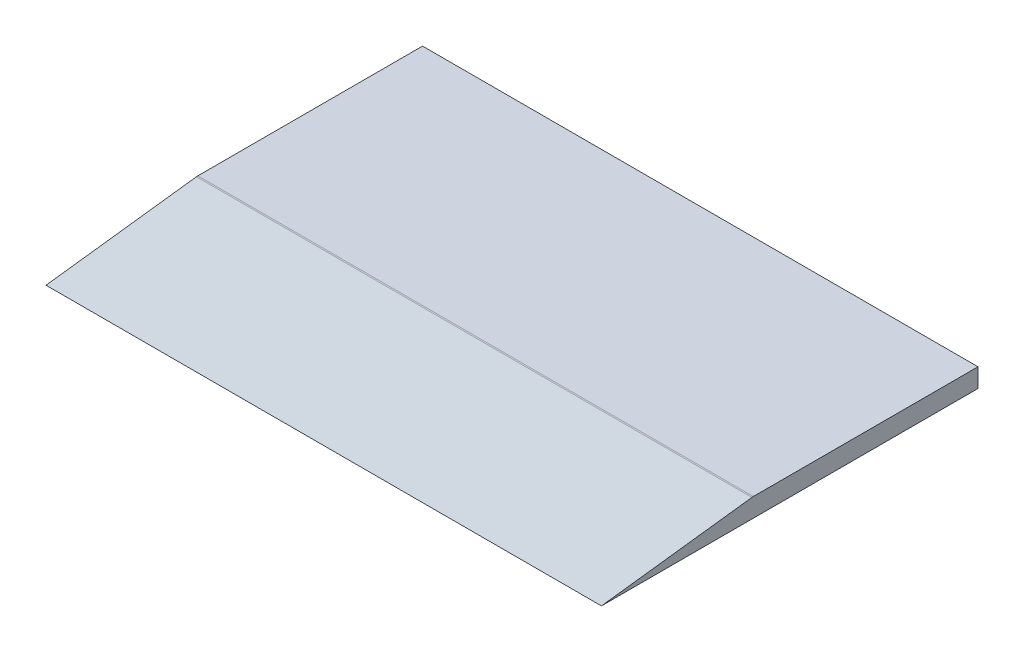
ISO-10303-21;
HEADER;
FILE_DESCRIPTION(('STEP AP214'),'2;1');
FILE_NAME('part.step','',(''),(''),'','','');
FILE_SCHEMA(('AUTOMOTIVE_DESIGN { 1 0 10303 214 1 1 1 1 }'));
ENDSEC;
DATA;
#1=APPLICATION_CONTEXT('core data for automotive mechanical design processes');
#2=APPLICATION_PROTOCOL_DEFINITION('international standard','automotive_design',2000,#1);
#3=PRODUCT_CONTEXT('',#1,'mechanical');
#4=PRODUCT('Part','Part','',(#3));
#5=PRODUCT_RELATED_PRODUCT_CATEGORY('part','',(#4));
#6=PRODUCT_DEFINITION_FORMATION('','',#4);
#7=PRODUCT_DEFINITION_CONTEXT('part definition',#1,'design');
#8=PRODUCT_DEFINITION('design','',#6,#7);
#9=PRODUCT_DEFINITION_SHAPE('','',#8);
#10=(LENGTH_UNIT() NAMED_UNIT(*) SI_UNIT(.MILLI.,.METRE.));
#11=(NAMED_UNIT(*) PLANE_ANGLE_UNIT() SI_UNIT($,.RADIAN.));
#12=(NAMED_UNIT(*) SI_UNIT($,.STERADIAN.) SOLID_ANGLE_UNIT());
#13=UNCERTAINTY_MEASURE_WITH_UNIT(LENGTH_MEASURE(1.E-05),#10,'distance_accuracy_value','');
#14=(GEOMETRIC_REPRESENTATION_CONTEXT(3) GLOBAL_UNCERTAINTY_ASSIGNED_CONTEXT((#13)) GLOBAL_UNIT_ASSIGNED_CONTEXT((#10,
#11,#12)) REPRESENTATION_CONTEXT('',''));
#15=CARTESIAN_POINT('',(0.,0.,0.));
#16=DIRECTION('',(0.,0.,1.));
#17=DIRECTION('',(1.,0.,0.));
#18=AXIS2_PLACEMENT_3D('',#15,#16,#17);
#19=CARTESIAN_POINT('',(0.,12.7,0.));
#20=DIRECTION('',(1.,0.,0.));
#21=DIRECTION('',(0.,0.,-1.));
#22=AXIS2_PLACEMENT_3D('',#19,#20,#21);
#23=PLANE('',#22);
#24=DIRECTION('',(0.,-0.1236014767405,0.992331937885488));
#25=VECTOR('',#24,1.);
#26=CARTESIAN_POINT('',(0.,12.7,-101.961691263647));
#27=LINE('',#26,#25);
#28=CARTESIAN_POINT('',(0.,12.6415693666874,-101.492582114501));
#29=VERTEX_POINT('',#28);
#30=CARTESIAN_POINT('',(0.,0.,0.));
#31=VERTEX_POINT('',#30);
#32=EDGE_CURVE('E96',#29,#31,#27,.T.);
#33=ORIENTED_EDGE('',*,*,#32,.F.);
#34=CARTESIAN_POINT('',(0.,5.08,-102.434425367263));
#35=DIRECTION('',(1.,0.,0.));
#36=DIRECTION('',(0.,0.,-1.));
#37=AXIS2_PLACEMENT_3D('',#34,#35,#36);
#38=CIRCLE('',#37,7.62);
#39=CARTESIAN_POINT('',(0.,12.7,-102.434425367263));
#40=VERTEX_POINT('',#39);
#41=EDGE_CURVE('E11',#29,#40,#38,.F.);
#42=ORIENTED_EDGE('',*,*,#41,.T.);
#43=DIRECTION('',(0.,0.,1.));
#44=VECTOR('',#43,1.);
#45=CARTESIAN_POINT('',(0.,12.7,0.));
#46=LINE('',#45,#44);
#47=CARTESIAN_POINT('',(0.,12.7,-254.));
#48=VERTEX_POINT('',#47);
#49=EDGE_CURVE('E113',#48,#40,#46,.T.);
#50=ORIENTED_EDGE('',*,*,#49,.F.);
#51=DIRECTION('',(0.,-1.,0.));
#52=VECTOR('',#51,1.);
#53=CARTESIAN_POINT('',(0.,12.7,-254.));
#54=LINE('',#53,#52);
#55=CARTESIAN_POINT('',(0.,0.,-254.));
#56=VERTEX_POINT('',#55);
#57=EDGE_CURVE('E117',#48,#56,#54,.T.);
#58=ORIENTED_EDGE('',*,*,#57,.T.);
#59=DIRECTION('',(0.,0.,1.));
#60=VECTOR('',#59,1.);
#61=CARTESIAN_POINT('',(0.,0.,0.));
#62=LINE('',#61,#60);
#63=EDGE_CURVE('E105',#56,#31,#62,.T.);
#64=ORIENTED_EDGE('',*,*,#63,.T.);
#65=EDGE_LOOP('',(#33,#42,#50,#58,#64));
#66=FACE_BOUND('',#65,.T.);
#67=ADVANCED_FACE('F45',(#66),#23,.F.);
#68=CARTESIAN_POINT('',(374.6754,12.7,0.));
#69=DIRECTION('',(-1.,0.,0.));
#70=DIRECTION('',(0.,0.,1.));
#71=AXIS2_PLACEMENT_3D('',#68,#69,#70);
#72=PLANE('',#71);
#73=DIRECTION('',(0.,0.,-1.));
#74=VECTOR('',#73,1.);
#75=CARTESIAN_POINT('',(374.6754,12.7,0.));
#76=LINE('',#75,#74);
#77=CARTESIAN_POINT('',(374.6754,12.7,-102.434425367263));
#78=VERTEX_POINT('',#77);
#79=CARTESIAN_POINT('',(374.6754,12.7,-254.));
#80=VERTEX_POINT('',#79);
#81=EDGE_CURVE('E133',#78,#80,#76,.T.);
#82=ORIENTED_EDGE('',*,*,#81,.F.);
#83=CARTESIAN_POINT('',(374.6754,5.08,-102.434425367263));
#84=DIRECTION('',(-1.,0.,0.));
#85=DIRECTION('',(0.,0.,1.));
#86=AXIS2_PLACEMENT_3D('',#83,#84,#85);
#87=CIRCLE('',#86,7.62);
#88=CARTESIAN_POINT('',(374.6754,12.6415693666874,-101.492582114501));
#89=VERTEX_POINT('',#88);
#90=EDGE_CURVE('E68',#78,#89,#87,.F.);
#91=ORIENTED_EDGE('',*,*,#90,.T.);
#92=DIRECTION('',(0.,-0.1236014767405,0.992331937885488));
#93=VECTOR('',#92,1.);
#94=CARTESIAN_POINT('',(374.6754,12.7,-101.961691263647));
#95=LINE('',#94,#93);
#96=CARTESIAN_POINT('',(374.6754,0.,0.));
#97=VERTEX_POINT('',#96);
#98=EDGE_CURVE('E88',#89,#97,#95,.T.);
#99=ORIENTED_EDGE('',*,*,#98,.T.);
#100=DIRECTION('',(0.,0.,-1.));
#101=VECTOR('',#100,1.);
#102=CARTESIAN_POINT('',(374.6754,0.,0.));
#103=LINE('',#102,#101);
#104=CARTESIAN_POINT('',(374.6754,0.,-254.));
#105=VERTEX_POINT('',#104);
#106=EDGE_CURVE('E93',#97,#105,#103,.T.);
#107=ORIENTED_EDGE('',*,*,#106,.T.);
#108=DIRECTION('',(0.,-1.,0.));
#109=VECTOR('',#108,1.);
#110=CARTESIAN_POINT('',(374.6754,12.7,-254.));
#111=LINE('',#110,#109);
#112=EDGE_CURVE('E121',#80,#105,#111,.T.);
#113=ORIENTED_EDGE('',*,*,#112,.F.);
#114=EDGE_LOOP('',(#82,#91,#99,#107,#113));
#115=FACE_BOUND('',#114,.T.);
#116=ADVANCED_FACE('F90',(#115),#72,.F.);
#117=CARTESIAN_POINT('',(0.,12.7,0.));
#118=DIRECTION('',(0.,-1.,0.));
#119=DIRECTION('',(0.,0.,-1.));
#120=AXIS2_PLACEMENT_3D('',#117,#118,#119);
#121=PLANE('',#120);
#122=ORIENTED_EDGE('',*,*,#49,.T.);
#123=DIRECTION('',(1.,0.,0.));
#124=VECTOR('',#123,1.);
#125=CARTESIAN_POINT('',(374.6754,12.7,-102.434425367263));
#126=LINE('',#125,#124);
#127=EDGE_CURVE('E125',#40,#78,#126,.T.);
#128=ORIENTED_EDGE('',*,*,#127,.T.);
#129=ORIENTED_EDGE('',*,*,#81,.T.);
#130=DIRECTION('',(-1.,0.,0.));
#131=VECTOR('',#130,1.);
#132=CARTESIAN_POINT('',(0.,12.7,-254.));
#133=LINE('',#132,#131);
#134=EDGE_CURVE('E122',#80,#48,#133,.T.);
#135=ORIENTED_EDGE('',*,*,#134,.T.);
#136=EDGE_LOOP('',(#122,#128,#129,#135));
#137=FACE_BOUND('',#136,.T.);
#138=ADVANCED_FACE('F151',(#137),#121,.F.);
#139=CARTESIAN_POINT('',(0.,12.7,-254.));
#140=DIRECTION('',(0.,0.,1.));
#141=DIRECTION('',(1.,0.,0.));
#142=AXIS2_PLACEMENT_3D('',#139,#140,#141);
#143=PLANE('',#142);
#144=DIRECTION('',(-1.,0.,0.));
#145=VECTOR('',#144,1.);
#146=CARTESIAN_POINT('',(0.,0.,-254.));
#147=LINE('',#146,#145);
#148=EDGE_CURVE('E109',#105,#56,#147,.T.);
#149=ORIENTED_EDGE('',*,*,#148,.T.);
#150=ORIENTED_EDGE('',*,*,#57,.F.);
#151=ORIENTED_EDGE('',*,*,#134,.F.);
#152=ORIENTED_EDGE('',*,*,#112,.T.);
#153=EDGE_LOOP('',(#149,#150,#151,#152));
#154=FACE_BOUND('',#153,.T.);
#155=ADVANCED_FACE('F150',(#154),#143,.F.);
#156=CARTESIAN_POINT('',(0.,0.,0.));
#157=DIRECTION('',(0.,-1.,0.));
#158=DIRECTION('',(0.,0.,-1.));
#159=AXIS2_PLACEMENT_3D('',#156,#157,#158);
#160=PLANE('',#159);
#161=ORIENTED_EDGE('',*,*,#63,.F.);
#162=ORIENTED_EDGE('',*,*,#148,.F.);
#163=ORIENTED_EDGE('',*,*,#106,.F.);
#164=DIRECTION('',(1.,0.,0.));
#165=VECTOR('',#164,1.);
#166=CARTESIAN_POINT('',(0.,0.,0.));
#167=LINE('',#166,#165);
#168=EDGE_CURVE('E99',#31,#97,#167,.T.);
#169=ORIENTED_EDGE('',*,*,#168,.F.);
#170=EDGE_LOOP('',(#161,#162,#163,#169));
#171=FACE_BOUND('',#170,.T.);
#172=ADVANCED_FACE('F108',(#171),#160,.T.);
#173=CARTESIAN_POINT('',(0.,12.7,-101.961691263647));
#174=DIRECTION('',(0.,0.992331937885488,0.1236014767405));
#175=DIRECTION('',(0.,-0.1236014767405,0.992331937885488));
#176=AXIS2_PLACEMENT_3D('',#173,#174,#175);
#177=PLANE('',#176);
#178=ORIENTED_EDGE('',*,*,#98,.F.);
#179=DIRECTION('',(1.,0.,0.));
#180=VECTOR('',#179,1.);
#181=CARTESIAN_POINT('',(0.,12.6415693666874,-101.492582114501));
#182=LINE('',#181,#180);
#183=EDGE_CURVE('E54',#89,#29,#182,.F.);
#184=ORIENTED_EDGE('',*,*,#183,.T.);
#185=ORIENTED_EDGE('',*,*,#32,.T.);
#186=ORIENTED_EDGE('',*,*,#168,.T.);
#187=EDGE_LOOP('',(#178,#184,#185,#186));
#188=FACE_BOUND('',#187,.T.);
#189=ADVANCED_FACE('F100',(#188),#177,.T.);
#190=CARTESIAN_POINT('',(0.,5.08,-102.434425367263));
#191=DIRECTION('',(-1.,0.,0.));
#192=DIRECTION('',(0.,0.,1.));
#193=AXIS2_PLACEMENT_3D('',#190,#191,#192);
#194=CYLINDRICAL_SURFACE('',#193,7.62);
#195=ORIENTED_EDGE('',*,*,#41,.F.);
#196=ORIENTED_EDGE('',*,*,#183,.F.);
#197=ORIENTED_EDGE('',*,*,#90,.F.);
#198=ORIENTED_EDGE('',*,*,#127,.F.);
#199=EDGE_LOOP('',(#195,#196,#197,#198));
#200=FACE_BOUND('',#199,.T.);
#201=ADVANCED_FACE('F47',(#200),#194,.T.);
#202=CLOSED_SHELL('',(#67,#116,#138,#155,#172,#189,#201));
#203=MANIFOLD_SOLID_BREP('B2',#202);
#204=ADVANCED_BREP_SHAPE_REPRESENTATION('',(#18,#203),#14);
#205=SHAPE_DEFINITION_REPRESENTATION(#9,#204);
ENDSEC;
END-ISO-10303-21;
